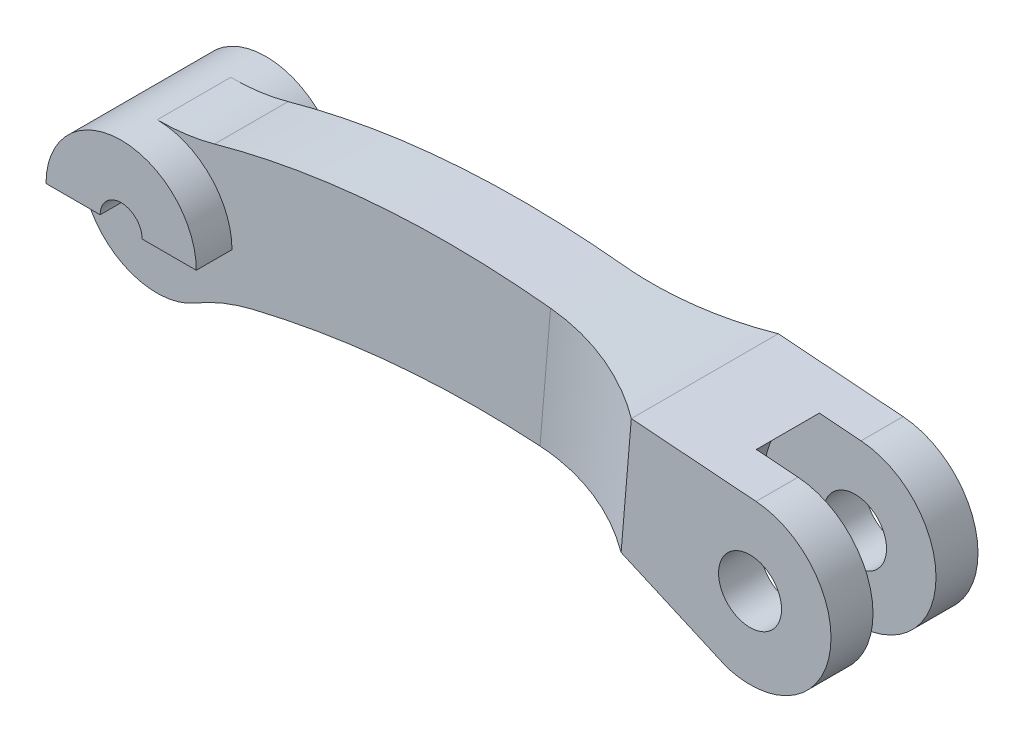
ISO-10303-21;
HEADER;
FILE_DESCRIPTION(('STEP AP214'),'2;1');
FILE_NAME('part.step','',(''),(''),'','','');
FILE_SCHEMA(('AUTOMOTIVE_DESIGN { 1 0 10303 214 1 1 1 1 }'));
ENDSEC;
DATA;
#1=APPLICATION_CONTEXT('core data for automotive mechanical design processes');
#2=APPLICATION_PROTOCOL_DEFINITION('international standard','automotive_design',2000,#1);
#3=PRODUCT_CONTEXT('',#1,'mechanical');
#4=PRODUCT('Part','Part','',(#3));
#5=PRODUCT_RELATED_PRODUCT_CATEGORY('part','',(#4));
#6=PRODUCT_DEFINITION_FORMATION('','',#4);
#7=PRODUCT_DEFINITION_CONTEXT('part definition',#1,'design');
#8=PRODUCT_DEFINITION('design','',#6,#7);
#9=PRODUCT_DEFINITION_SHAPE('','',#8);
#10=(LENGTH_UNIT() NAMED_UNIT(*) SI_UNIT(.MILLI.,.METRE.));
#11=(NAMED_UNIT(*) PLANE_ANGLE_UNIT() SI_UNIT($,.RADIAN.));
#12=(NAMED_UNIT(*) SI_UNIT($,.STERADIAN.) SOLID_ANGLE_UNIT());
#13=UNCERTAINTY_MEASURE_WITH_UNIT(LENGTH_MEASURE(1.E-05),#10,'distance_accuracy_value','');
#14=(GEOMETRIC_REPRESENTATION_CONTEXT(3) GLOBAL_UNCERTAINTY_ASSIGNED_CONTEXT((#13)) GLOBAL_UNIT_ASSIGNED_CONTEXT((#10,
#11,#12)) REPRESENTATION_CONTEXT('',''));
#15=CARTESIAN_POINT('',(0.,0.,0.));
#16=DIRECTION('',(0.,0.,1.));
#17=DIRECTION('',(1.,0.,0.));
#18=AXIS2_PLACEMENT_3D('',#15,#16,#17);
#19=CARTESIAN_POINT('',(15.4789562174928,-0.67222831700729,1.75));
#20=DIRECTION('',(0.,0.,1.));
#21=DIRECTION('',(1.,0.,0.));
#22=AXIS2_PLACEMENT_3D('',#19,#20,#21);
#23=PLANE('',#22);
#24=CARTESIAN_POINT('',(0.,0.,1.75));
#25=DIRECTION('',(0.,0.,1.));
#26=DIRECTION('',(1.,0.,0.));
#27=AXIS2_PLACEMENT_3D('',#24,#25,#26);
#28=CIRCLE('',#27,3.57888118592707);
#29=CARTESIAN_POINT('',(3.57888118592706,0.,1.75));
#30=VERTEX_POINT('',#29);
#31=CARTESIAN_POINT('',(0.0200252761575566,3.57882516076123,1.75));
#32=VERTEX_POINT('',#31);
#33=EDGE_CURVE('E244',#30,#32,#28,.T.);
#34=ORIENTED_EDGE('',*,*,#33,.F.);
#35=DIRECTION('',(1.,0.,0.));
#36=VECTOR('',#35,1.);
#37=CARTESIAN_POINT('',(0.999999999999999,0.,1.75));
#38=LINE('',#37,#36);
#39=CARTESIAN_POINT('',(0.999999999999999,0.,1.75));
#40=VERTEX_POINT('',#39);
#41=EDGE_CURVE('E213',#40,#30,#38,.T.);
#42=ORIENTED_EDGE('',*,*,#41,.F.);
#43=CARTESIAN_POINT('',(0.,0.,1.75));
#44=DIRECTION('',(0.,0.,1.));
#45=DIRECTION('',(1.,0.,0.));
#46=AXIS2_PLACEMENT_3D('',#43,#44,#45);
#47=CIRCLE('',#46,0.999999999999999);
#48=CARTESIAN_POINT('',(-0.999999999999999,0.,1.75));
#49=VERTEX_POINT('',#48);
#50=EDGE_CURVE('E321',#49,#40,#47,.T.);
#51=ORIENTED_EDGE('',*,*,#50,.F.);
#52=DIRECTION('',(1.,0.,0.));
#53=VECTOR('',#52,1.);
#54=CARTESIAN_POINT('',(-0.999999999999999,0.,1.75));
#55=LINE('',#54,#53);
#56=CARTESIAN_POINT('',(-3.57888118592708,0.,1.75));
#57=VERTEX_POINT('',#56);
#58=EDGE_CURVE('E236',#57,#49,#55,.T.);
#59=ORIENTED_EDGE('',*,*,#58,.F.);
#60=CARTESIAN_POINT('',(0.,0.,1.75));
#61=DIRECTION('',(0.,0.,1.));
#62=DIRECTION('',(1.,0.,0.));
#63=AXIS2_PLACEMENT_3D('',#60,#61,#62);
#64=CIRCLE('',#63,3.57888118592708);
#65=CARTESIAN_POINT('',(1.82196730602309,-3.08039375385125,1.75));
#66=VERTEX_POINT('',#65);
#67=EDGE_CURVE('E421',#57,#66,#64,.T.);
#68=ORIENTED_EDGE('',*,*,#67,.T.);
#69=CARTESIAN_POINT('',(6.91285244964688,-11.6875354660825,1.75));
#70=DIRECTION('',(0.,0.,1.));
#71=DIRECTION('',(1.,0.,0.));
#72=AXIS2_PLACEMENT_3D('',#69,#70,#71);
#73=CIRCLE('',#72,10.);
#74=CARTESIAN_POINT('',(4.57497043637673,-1.96465998132859,1.75));
#75=VERTEX_POINT('',#74);
#76=EDGE_CURVE('E13',#66,#75,#73,.F.);
#77=ORIENTED_EDGE('',*,*,#76,.T.);
#78=CARTESIAN_POINT('',(2.56834457009332,-2.49238775319069,1.75));
#79=CARTESIAN_POINT('',(15.4492029121807,1.18573782839704,1.75));
#80=CARTESIAN_POINT('',(28.4490744755167,-2.56800117163254,1.75));
#81=B_SPLINE_CURVE_WITH_KNOTS('',2,(#78,#79,#80),.UNSPECIFIED.,.F.,.F.,(3,3),(0.,1.),.UNSPECIFIED.);
#82=CARTESIAN_POINT('',(18.2484008446483,-0.765332039042507,1.75));
#83=VERTEX_POINT('',#82);
#84=EDGE_CURVE('E326',#75,#83,#81,.T.);
#85=ORIENTED_EDGE('',*,*,#84,.T.);
#86=DIRECTION('',(0.0839934272279586,0.996466308603809,0.));
#87=VECTOR('',#86,1.);
#88=CARTESIAN_POINT('',(18.7146392151198,4.76594395821291,1.75));
#89=LINE('',#88,#87);
#90=CARTESIAN_POINT('',(18.7489520635338,5.17301863681444,1.75));
#91=VERTEX_POINT('',#90);
#92=EDGE_CURVE('E456',#83,#91,#89,.T.);
#93=ORIENTED_EDGE('',*,*,#92,.T.);
#94=CARTESIAN_POINT('',(29.5303772913072,2.96301442984674,1.75));
#95=CARTESIAN_POINT('',(13.9500427176749,7.64913489793884,1.75));
#96=CARTESIAN_POINT('',(1.03776536775901,3.42511803949336,1.75));
#97=B_SPLINE_CURVE_WITH_KNOTS('',2,(#94,#95,#96),.UNSPECIFIED.,.F.,.F.,(3,3),(0.,1.),.UNSPECIFIED.);
#98=CARTESIAN_POINT('',(2.75285584533228,3.94361117557761,1.75));
#99=VERTEX_POINT('',#98);
#100=EDGE_CURVE('E331',#91,#99,#97,.T.);
#101=ORIENTED_EDGE('',*,*,#100,.T.);
#102=CARTESIAN_POINT('',(0.0759792883676022,13.5786686169618,1.75));
#103=DIRECTION('',(0.,0.,1.));
#104=DIRECTION('',(1.,0.,0.));
#105=AXIS2_PLACEMENT_3D('',#102,#103,#104);
#106=CIRCLE('',#105,10.);
#107=EDGE_CURVE('E502',#99,#32,#106,.F.);
#108=ORIENTED_EDGE('',*,*,#107,.T.);
#109=EDGE_LOOP('',(#34,#42,#51,#59,#68,#77,#85,#93,#101,#108));
#110=FACE_BOUND('',#109,.T.);
#111=ADVANCED_FACE('F46',(#110),#23,.T.);
#112=CARTESIAN_POINT('',(30.,0.,3.5));
#113=DIRECTION('',(0.,0.,-1.));
#114=DIRECTION('',(-1.,0.,0.));
#115=AXIS2_PLACEMENT_3D('',#112,#113,#114);
#116=CYLINDRICAL_SURFACE('',#115,3.85694958374146);
#117=CARTESIAN_POINT('',(30.,0.,-1.5));
#118=DIRECTION('',(0.,0.,1.));
#119=DIRECTION('',(1.,0.,0.));
#120=AXIS2_PLACEMENT_3D('',#117,#118,#119);
#121=CIRCLE('',#120,3.85694958374146);
#122=CARTESIAN_POINT('',(28.92532622388,-3.7042052273657,-1.5));
#123=VERTEX_POINT('',#122);
#124=CARTESIAN_POINT('',(30.2880988867762,3.8461746090059,-1.5));
#125=VERTEX_POINT('',#124);
#126=EDGE_CURVE('E275',#123,#125,#121,.T.);
#127=ORIENTED_EDGE('',*,*,#126,.F.);
#128=DIRECTION('',(0.,0.,-1.));
#129=VECTOR('',#128,1.);
#130=CARTESIAN_POINT('',(28.92532622388,-3.7042052273657,3.5));
#131=LINE('',#130,#129);
#132=CARTESIAN_POINT('',(28.92532622388,-3.7042052273657,-3.5));
#133=VERTEX_POINT('',#132);
#134=EDGE_CURVE('E301',#123,#133,#131,.T.);
#135=ORIENTED_EDGE('',*,*,#134,.T.);
#136=CARTESIAN_POINT('',(30.,0.,-3.5));
#137=DIRECTION('',(0.,0.,1.));
#138=DIRECTION('',(1.,0.,0.));
#139=AXIS2_PLACEMENT_3D('',#136,#137,#138);
#140=CIRCLE('',#139,3.85694958374146);
#141=CARTESIAN_POINT('',(30.2880988867762,3.8461746090059,-3.5));
#142=VERTEX_POINT('',#141);
#143=EDGE_CURVE('E286',#133,#142,#140,.T.);
#144=ORIENTED_EDGE('',*,*,#143,.T.);
#145=DIRECTION('',(0.,0.,-1.));
#146=VECTOR('',#145,1.);
#147=CARTESIAN_POINT('',(30.2880988867762,3.8461746090059,3.5));
#148=LINE('',#147,#146);
#149=EDGE_CURVE('E317',#125,#142,#148,.T.);
#150=ORIENTED_EDGE('',*,*,#149,.F.);
#151=EDGE_LOOP('',(#127,#135,#144,#150));
#152=FACE_BOUND('',#151,.T.);
#153=ADVANCED_FACE('F392',(#152),#116,.T.);
#154=CARTESIAN_POINT('',(30.2880988867762,3.8461746090059,3.5));
#155=DIRECTION('',(-0.0746960468427019,-0.99720634804742,0.));
#156=DIRECTION('',(0.99720634804742,-0.0746960468427019,0.));
#157=AXIS2_PLACEMENT_3D('',#154,#155,#156);
#158=PLANE('',#157);
#159=DIRECTION('',(-0.99720634804742,0.0746960468427019,0.));
#160=VECTOR('',#159,1.);
#161=CARTESIAN_POINT('',(30.2880988867762,3.8461746090059,-1.5));
#162=LINE('',#161,#160);
#163=CARTESIAN_POINT('',(28.2994147796355,3.99513760098162,-1.5));
#164=VERTEX_POINT('',#163);
#165=EDGE_CURVE('E277',#125,#164,#162,.T.);
#166=ORIENTED_EDGE('',*,*,#165,.F.);
#167=ORIENTED_EDGE('',*,*,#149,.T.);
#168=DIRECTION('',(-0.99720634804742,0.0746960468427019,0.));
#169=VECTOR('',#168,1.);
#170=CARTESIAN_POINT('',(30.2880988867762,3.8461746090059,-3.5));
#171=LINE('',#170,#169);
#172=CARTESIAN_POINT('',(24.3459964462684,4.29126961174948,-3.5));
#173=VERTEX_POINT('',#172);
#174=EDGE_CURVE('E304',#142,#173,#171,.T.);
#175=ORIENTED_EDGE('',*,*,#174,.T.);
#176=DIRECTION('',(0.,0.,-1.));
#177=VECTOR('',#176,1.);
#178=CARTESIAN_POINT('',(24.3459964462684,4.29126961174948,1.75));
#179=LINE('',#178,#177);
#180=CARTESIAN_POINT('',(24.3459964462701,4.29126961176963,3.5));
#181=VERTEX_POINT('',#180);
#182=EDGE_CURVE('E427',#173,#181,#179,.F.);
#183=ORIENTED_EDGE('',*,*,#182,.T.);
#184=DIRECTION('',(-0.99720634804742,0.0746960468427019,0.));
#185=VECTOR('',#184,1.);
#186=CARTESIAN_POINT('',(30.2880988867762,3.8461746090059,3.5));
#187=LINE('',#186,#185);
#188=CARTESIAN_POINT('',(30.2880988867762,3.8461746090059,3.5));
#189=VERTEX_POINT('',#188);
#190=EDGE_CURVE('E292',#189,#181,#187,.T.);
#191=ORIENTED_EDGE('',*,*,#190,.F.);
#192=CARTESIAN_POINT('',(30.2880988867762,3.8461746090059,1.5));
#193=VERTEX_POINT('',#192);
#194=EDGE_CURVE('E318',#189,#193,#148,.T.);
#195=ORIENTED_EDGE('',*,*,#194,.T.);
#196=DIRECTION('',(-0.99720634804742,0.0746960468427019,0.));
#197=VECTOR('',#196,1.);
#198=CARTESIAN_POINT('',(30.2880988867762,3.8461746090059,1.5));
#199=LINE('',#198,#197);
#200=CARTESIAN_POINT('',(28.2994147796355,3.99513760098162,1.5));
#201=VERTEX_POINT('',#200);
#202=EDGE_CURVE('E269',#193,#201,#199,.T.);
#203=ORIENTED_EDGE('',*,*,#202,.T.);
#204=DIRECTION('',(0.,0.,1.));
#205=VECTOR('',#204,1.);
#206=CARTESIAN_POINT('',(28.2994147796355,3.99513760098162,-1.5));
#207=LINE('',#206,#205);
#208=EDGE_CURVE('E279',#201,#164,#207,.F.);
#209=ORIENTED_EDGE('',*,*,#208,.T.);
#210=EDGE_LOOP('',(#166,#167,#175,#183,#191,#195,#203,#209));
#211=FACE_BOUND('',#210,.T.);
#212=ADVANCED_FACE('F398',(#211),#158,.F.);
#213=CARTESIAN_POINT('',(23.860056265525,-1.47374122408052,3.5));
#214=DIRECTION('',(0.403002780325365,0.915198753850783,0.));
#215=DIRECTION('',(-0.915198753850783,0.403002780325365,0.));
#216=AXIS2_PLACEMENT_3D('',#213,#214,#215);
#217=PLANE('',#216);
#218=DIRECTION('',(0.915198753850783,-0.403002780325365,0.));
#219=VECTOR('',#218,1.);
#220=CARTESIAN_POINT('',(23.860056265525,-1.47374122408052,-1.5));
#221=LINE('',#220,#219);
#222=CARTESIAN_POINT('',(26.5755370853072,-2.6694883945043,-1.5));
#223=VERTEX_POINT('',#222);
#224=EDGE_CURVE('E273',#223,#123,#221,.T.);
#225=ORIENTED_EDGE('',*,*,#224,.F.);
#226=DIRECTION('',(0.,0.,1.));
#227=VECTOR('',#226,1.);
#228=CARTESIAN_POINT('',(26.5755370853072,-2.6694883945043,-1.5));
#229=LINE('',#228,#227);
#230=CARTESIAN_POINT('',(26.5755370853072,-2.6694883945043,1.5));
#231=VERTEX_POINT('',#230);
#232=EDGE_CURVE('E428',#223,#231,#229,.T.);
#233=ORIENTED_EDGE('',*,*,#232,.T.);
#234=DIRECTION('',(0.915198753850783,-0.403002780325365,0.));
#235=VECTOR('',#234,1.);
#236=CARTESIAN_POINT('',(23.860056265525,-1.47374122408052,1.5));
#237=LINE('',#236,#235);
#238=CARTESIAN_POINT('',(28.92532622388,-3.7042052273657,1.5));
#239=VERTEX_POINT('',#238);
#240=EDGE_CURVE('E263',#231,#239,#237,.T.);
#241=ORIENTED_EDGE('',*,*,#240,.T.);
#242=CARTESIAN_POINT('',(28.92532622388,-3.7042052273657,3.5));
#243=VERTEX_POINT('',#242);
#244=EDGE_CURVE('E312',#243,#239,#131,.T.);
#245=ORIENTED_EDGE('',*,*,#244,.F.);
#246=DIRECTION('',(0.915198753850783,-0.403002780325365,0.));
#247=VECTOR('',#246,1.);
#248=CARTESIAN_POINT('',(23.860056265525,-1.47374122408052,3.5));
#249=LINE('',#248,#247);
#250=CARTESIAN_POINT('',(23.860056265525,-1.47374122408052,3.5));
#251=VERTEX_POINT('',#250);
#252=EDGE_CURVE('E299',#251,#243,#249,.T.);
#253=ORIENTED_EDGE('',*,*,#252,.F.);
#254=DIRECTION('',(0.,0.,-1.));
#255=VECTOR('',#254,1.);
#256=CARTESIAN_POINT('',(23.860056265525,-1.47374122408052,3.5));
#257=LINE('',#256,#255);
#258=CARTESIAN_POINT('',(23.860056265525,-1.47374122408052,-3.5));
#259=VERTEX_POINT('',#258);
#260=EDGE_CURVE('E315',#251,#259,#257,.T.);
#261=ORIENTED_EDGE('',*,*,#260,.T.);
#262=DIRECTION('',(0.915198753850783,-0.403002780325365,0.));
#263=VECTOR('',#262,1.);
#264=CARTESIAN_POINT('',(23.860056265525,-1.47374122408052,-3.5));
#265=LINE('',#264,#263);
#266=EDGE_CURVE('E293',#259,#133,#265,.T.);
#267=ORIENTED_EDGE('',*,*,#266,.T.);
#268=ORIENTED_EDGE('',*,*,#134,.F.);
#269=EDGE_LOOP('',(#225,#233,#241,#245,#253,#261,#267,#268));
#270=FACE_BOUND('',#269,.T.);
#271=ADVANCED_FACE('F478',(#270),#217,.F.);
#272=CARTESIAN_POINT('',(30.,0.,1.75));
#273=DIRECTION('',(0.,0.,-1.));
#274=DIRECTION('',(-1.,0.,0.));
#275=AXIS2_PLACEMENT_3D('',#272,#273,#274);
#276=CYLINDRICAL_SURFACE('',#275,1.5);
#277=CARTESIAN_POINT('',(30.,0.,-3.5));
#278=DIRECTION('',(0.,0.,1.));
#279=DIRECTION('',(1.,0.,0.));
#280=AXIS2_PLACEMENT_3D('',#277,#278,#279);
#281=CIRCLE('',#280,1.5);
#282=CARTESIAN_POINT('',(31.5,0.,-3.5));
#283=VERTEX_POINT('',#282);
#284=EDGE_CURVE('E282',#283,#283,#281,.T.);
#285=ORIENTED_EDGE('',*,*,#284,.F.);
#286=EDGE_LOOP('',(#285));
#287=FACE_BOUND('',#286,.T.);
#288=CARTESIAN_POINT('',(30.,0.,-1.5));
#289=DIRECTION('',(0.,0.,1.));
#290=DIRECTION('',(1.,0.,0.));
#291=AXIS2_PLACEMENT_3D('',#288,#289,#290);
#292=CIRCLE('',#291,1.5);
#293=CARTESIAN_POINT('',(31.5,0.,-1.5));
#294=VERTEX_POINT('',#293);
#295=EDGE_CURVE('E272',#294,#294,#292,.T.);
#296=ORIENTED_EDGE('',*,*,#295,.T.);
#297=EDGE_LOOP('',(#296));
#298=FACE_BOUND('',#297,.T.);
#299=ADVANCED_FACE('F407',(#287,#298),#276,.F.);
#300=CARTESIAN_POINT('',(15.4789562174928,-0.67222831700729,-1.75));
#301=DIRECTION('',(0.,0.,1.));
#302=DIRECTION('',(1.,0.,0.));
#303=AXIS2_PLACEMENT_3D('',#300,#301,#302);
#304=PLANE('',#303);
#305=CARTESIAN_POINT('',(0.,0.,-1.75));
#306=DIRECTION('',(0.,0.,1.));
#307=DIRECTION('',(1.,0.,0.));
#308=AXIS2_PLACEMENT_3D('',#305,#306,#307);
#309=CIRCLE('',#308,3.57888118592708);
#310=CARTESIAN_POINT('',(-3.57888118592708,0.,-1.75));
#311=VERTEX_POINT('',#310);
#312=CARTESIAN_POINT('',(1.82196730602309,-3.08039375385125,-1.75));
#313=VERTEX_POINT('',#312);
#314=EDGE_CURVE('E68',#311,#313,#309,.T.);
#315=ORIENTED_EDGE('',*,*,#314,.F.);
#316=DIRECTION('',(1.,0.,0.));
#317=VECTOR('',#316,1.);
#318=CARTESIAN_POINT('',(15.4789562174928,1.59702980007115E-13,-1.75));
#319=LINE('',#318,#317);
#320=CARTESIAN_POINT('',(-1.00000000000001,0.,-1.75));
#321=VERTEX_POINT('',#320);
#322=EDGE_CURVE('E223',#311,#321,#319,.T.);
#323=ORIENTED_EDGE('',*,*,#322,.T.);
#324=CARTESIAN_POINT('',(0.,0.,-1.75));
#325=DIRECTION('',(0.,0.,1.));
#326=DIRECTION('',(1.,0.,0.));
#327=AXIS2_PLACEMENT_3D('',#324,#325,#326);
#328=CIRCLE('',#327,0.999999999999999);
#329=CARTESIAN_POINT('',(0.999999999999999,0.,-1.75));
#330=VERTEX_POINT('',#329);
#331=EDGE_CURVE('E210',#321,#330,#328,.T.);
#332=ORIENTED_EDGE('',*,*,#331,.T.);
#333=DIRECTION('',(1.,0.,0.));
#334=VECTOR('',#333,1.);
#335=CARTESIAN_POINT('',(15.4789562174928,0.,-1.75));
#336=LINE('',#335,#334);
#337=CARTESIAN_POINT('',(3.57888118592706,0.,-1.75));
#338=VERTEX_POINT('',#337);
#339=EDGE_CURVE('E61',#330,#338,#336,.T.);
#340=ORIENTED_EDGE('',*,*,#339,.T.);
#341=CARTESIAN_POINT('',(0.,0.,-1.75));
#342=DIRECTION('',(0.,0.,1.));
#343=DIRECTION('',(1.,0.,0.));
#344=AXIS2_PLACEMENT_3D('',#341,#342,#343);
#345=CIRCLE('',#344,3.57888118592707);
#346=CARTESIAN_POINT('',(0.020025276157564,3.57882516076123,-1.75));
#347=VERTEX_POINT('',#346);
#348=EDGE_CURVE('E225',#338,#347,#345,.T.);
#349=ORIENTED_EDGE('',*,*,#348,.T.);
#350=CARTESIAN_POINT('',(0.0759792883676022,13.5786686169618,-1.75));
#351=DIRECTION('',(0.,0.,1.));
#352=DIRECTION('',(1.,0.,0.));
#353=AXIS2_PLACEMENT_3D('',#350,#351,#352);
#354=CIRCLE('',#353,10.);
#355=CARTESIAN_POINT('',(2.75285584533228,3.94361117557761,-1.75));
#356=VERTEX_POINT('',#355);
#357=EDGE_CURVE('E496',#347,#356,#354,.T.);
#358=ORIENTED_EDGE('',*,*,#357,.T.);
#359=CARTESIAN_POINT('',(29.5303772913072,2.96301442984674,-1.75));
#360=CARTESIAN_POINT('',(13.9500427176749,7.64913489793884,-1.75));
#361=CARTESIAN_POINT('',(1.03776536775901,3.42511803949336,-1.75));
#362=B_SPLINE_CURVE_WITH_KNOTS('',2,(#359,#360,#361),.UNSPECIFIED.,.F.,.F.,(3,3),(0.,1.),.UNSPECIFIED.);
#363=CARTESIAN_POINT('',(18.7489520635338,5.17301863681444,-1.75));
#364=VERTEX_POINT('',#363);
#365=EDGE_CURVE('E435',#364,#356,#362,.T.);
#366=ORIENTED_EDGE('',*,*,#365,.F.);
#367=DIRECTION('',(-0.0839934272279586,-0.996466308603809,0.));
#368=VECTOR('',#367,1.);
#369=CARTESIAN_POINT('',(18.2366551682102,-0.904678309680141,-1.75));
#370=LINE('',#369,#368);
#371=CARTESIAN_POINT('',(18.2484008446483,-0.765332039042507,-1.75));
#372=VERTEX_POINT('',#371);
#373=EDGE_CURVE('E453',#364,#372,#370,.T.);
#374=ORIENTED_EDGE('',*,*,#373,.T.);
#375=CARTESIAN_POINT('',(2.56834457009332,-2.49238775319069,-1.75));
#376=CARTESIAN_POINT('',(15.4492029121807,1.18573782839704,-1.75));
#377=CARTESIAN_POINT('',(28.4490744755167,-2.56800117163254,-1.75));
#378=B_SPLINE_CURVE_WITH_KNOTS('',2,(#375,#376,#377),.UNSPECIFIED.,.F.,.F.,(3,3),(0.,1.),.UNSPECIFIED.);
#379=CARTESIAN_POINT('',(4.57497043637672,-1.96465998132859,-1.75));
#380=VERTEX_POINT('',#379);
#381=EDGE_CURVE('E324',#380,#372,#378,.T.);
#382=ORIENTED_EDGE('',*,*,#381,.F.);
#383=CARTESIAN_POINT('',(6.91285244964688,-11.6875354660825,-1.75));
#384=DIRECTION('',(0.,0.,1.));
#385=DIRECTION('',(1.,0.,0.));
#386=AXIS2_PLACEMENT_3D('',#383,#384,#385);
#387=CIRCLE('',#386,10.);
#388=EDGE_CURVE('E54',#380,#313,#387,.T.);
#389=ORIENTED_EDGE('',*,*,#388,.T.);
#390=EDGE_LOOP('',(#315,#323,#332,#340,#349,#358,#366,#374,#382,#389));
#391=FACE_BOUND('',#390,.T.);
#392=ADVANCED_FACE('F346',(#391),#304,.F.);
#393=DIRECTION('',(0.,0.,-1.));
#394=VECTOR('',#393,1.);
#395=SURFACE_OF_LINEAR_EXTRUSION('',#81,#394);
#396=ORIENTED_EDGE('',*,*,#84,.F.);
#397=DIRECTION('',(0.,0.,-1.));
#398=VECTOR('',#397,1.);
#399=CARTESIAN_POINT('',(4.57497043637708,-1.9646599813285,1.75));
#400=LINE('',#399,#398);
#401=EDGE_CURVE('E503',#75,#380,#400,.T.);
#402=ORIENTED_EDGE('',*,*,#401,.T.);
#403=ORIENTED_EDGE('',*,*,#381,.T.);
#404=CARTESIAN_POINT('',(18.2484008446483,-0.76533203904251,-1.75));
#405=CARTESIAN_POINT('',(18.5282691285124,-0.783296112776408,-1.74996352775269));
#406=CARTESIAN_POINT('',(18.8079645500961,-0.803901787671125,-1.76179088571991));
#407=CARTESIAN_POINT('',(19.3649594725598,-0.850045605428343,-1.80894076762686));
#408=CARTESIAN_POINT('',(19.6422589715891,-0.875583752100337,-1.84426330971265));
#409=CARTESIAN_POINT('',(20.1855635273802,-0.930548961027655,-1.93700217112846));
#410=CARTESIAN_POINT('',(20.4516779011002,-0.959863383728166,-1.99384658610989));
#411=CARTESIAN_POINT('',(20.9778316830621,-1.022361447658,-2.12921462969119));
#412=CARTESIAN_POINT('',(21.2378721596619,-1.05554440219209,-2.20773441411484));
#413=CARTESIAN_POINT('',(21.701868804443,-1.11863192939122,-2.36907672061322));
#414=CARTESIAN_POINT('',(21.9071618127568,-1.14797646225319,-2.44830204982901));
#415=CARTESIAN_POINT('',(22.3117342808631,-1.20847361374403,-2.62026547727487));
#416=CARTESIAN_POINT('',(22.5110139239367,-1.23962617718128,-2.71300316315951));
#417=CARTESIAN_POINT('',(22.9067654346865,-1.3040125312927,-2.91361696809263));
#418=CARTESIAN_POINT('',(23.1030936393864,-1.33727606572953,-3.02176687150119));
#419=CARTESIAN_POINT('',(23.487773951348,-1.40484176058597,-3.25118065407654));
#420=CARTESIAN_POINT('',(23.6761252602329,-1.43914402438154,-3.37244584160566));
#421=CARTESIAN_POINT('',(23.8600562655186,-1.47374122413124,-3.49999999999855));
#422=B_SPLINE_CURVE_WITH_KNOTS('',3,(#404,#405,#406,#407,#408,#409,#410,#411,#412,#413,#414,
#415,#416,#417,#418,#419,#420,#421),.UNSPECIFIED.,.F.,.F.,(4,2,2,2,2,2,2,2,4),(0.,
0.841068827581901,1.68213830474856,2.50226977233456,3.32225588107799,3.98776793389279,
4.65325968207825,5.33253629646536,6.01188073714731),.UNSPECIFIED.);
#423=EDGE_CURVE('E355',#372,#259,#422,.T.);
#424=ORIENTED_EDGE('',*,*,#423,.T.);
#425=ORIENTED_EDGE('',*,*,#260,.F.);
#426=CARTESIAN_POINT('',(23.860056265525,-1.47374122408052,3.5));
#427=CARTESIAN_POINT('',(23.6314533389367,-1.43073418319835,3.3414474805543));
#428=CARTESIAN_POINT('',(23.3960022978897,-1.38818956161063,3.19262503956826));
#429=CARTESIAN_POINT('',(22.913018090357,-1.30485920775308,2.9153981028605));
#430=CARTESIAN_POINT('',(22.6654827194869,-1.26407379896826,2.78699735072365));
#431=CARTESIAN_POINT('',(22.1663691967778,-1.18610276475482,2.55458275984172));
#432=CARTESIAN_POINT('',(21.9150482642508,-1.14885249924155,2.45003792589635));
#433=CARTESIAN_POINT('',(21.4042316567726,-1.07753379656887,2.26208794372119));
#434=CARTESIAN_POINT('',(21.1447378725346,-1.0434646306178,2.17867794594733));
#435=CARTESIAN_POINT('',(20.6706286629399,-0.985399148902712,2.04776519082933));
#436=CARTESIAN_POINT('',(20.4571433646697,-0.960734916404846,1.99643134417925));
#437=CARTESIAN_POINT('',(20.0269512021953,-0.914125209313255,1.90808219158994));
#438=CARTESIAN_POINT('',(19.8102446723258,-0.892179454742584,1.8710654102966));
#439=CARTESIAN_POINT('',(19.3700697414867,-0.850805107568669,1.81091524567222));
#440=CARTESIAN_POINT('',(19.1465541651943,-0.831437928680498,1.78808468211419));
#441=CARTESIAN_POINT('',(18.6981965431113,-0.795925990317345,1.75761836470642));
#442=CARTESIAN_POINT('',(18.4733542748567,-0.779781788058739,1.74998523627873));
#443=CARTESIAN_POINT('',(18.2484008446483,-0.765332039042507,1.75));
#444=B_SPLINE_CURVE_WITH_KNOTS('',3,(#426,#427,#428,#429,#430,#431,#432,#433,#434,#435,#436,
#437,#438,#439,#440,#441,#442,#443),.UNSPECIFIED.,.F.,.F.,(4,2,2,2,2,2,2,2,4),(0.,
0.844299460205278,1.68875351451699,2.51202224693983,3.33510190286249,3.99747440087051,
4.65977862409652,5.33577416052052,6.0118864679418),.UNSPECIFIED.);
#445=EDGE_CURVE('E363',#251,#83,#444,.T.);
#446=ORIENTED_EDGE('',*,*,#445,.T.);
#447=EDGE_LOOP('',(#396,#402,#403,#424,#425,#446));
#448=FACE_BOUND('',#447,.T.);
#449=ADVANCED_FACE('F340',(#448),#395,.F.);
#450=DIRECTION('',(0.,0.,-1.));
#451=VECTOR('',#450,1.);
#452=SURFACE_OF_LINEAR_EXTRUSION('',#97,#451);
#453=ORIENTED_EDGE('',*,*,#365,.T.);
#454=DIRECTION('',(0.,0.,-1.));
#455=VECTOR('',#454,1.);
#456=CARTESIAN_POINT('',(2.75285584533228,3.94361117557761,-1.75));
#457=LINE('',#456,#455);
#458=EDGE_CURVE('E498',#356,#99,#457,.F.);
#459=ORIENTED_EDGE('',*,*,#458,.T.);
#460=ORIENTED_EDGE('',*,*,#100,.F.);
#461=CARTESIAN_POINT('',(18.7489520635154,5.17301863663513,1.75));
#462=CARTESIAN_POINT('',(18.9364036543828,5.15372367423393,1.74999316595883));
#463=CARTESIAN_POINT('',(19.1237437224031,5.13336739345639,1.75532447679933));
#464=CARTESIAN_POINT('',(19.4975871230781,5.09065953225252,1.77660684479373));
#465=CARTESIAN_POINT('',(19.6840904755827,5.06830799942639,1.79255764865978));
#466=CARTESIAN_POINT('',(20.0556565917793,5.0217359338948,1.83502255990889));
#467=CARTESIAN_POINT('',(20.2407193489809,4.99751539277423,1.86153671485514));
#468=CARTESIAN_POINT('',(20.6042591115819,4.94798232624849,1.92423986068627));
#469=CARTESIAN_POINT('',(20.782785885221,4.92271154499203,1.96017372905356));
#470=CARTESIAN_POINT('',(21.1373484439451,4.87070704119114,2.04186188563864));
#471=CARTESIAN_POINT('',(21.3133844245344,4.84397343427574,2.08761539849583));
#472=CARTESIAN_POINT('',(21.6624210482167,4.78922764134638,2.18877759816767));
#473=CARTESIAN_POINT('',(21.8354221740747,4.76121566128834,2.24418473373278));
#474=CARTESIAN_POINT('',(22.2121001150067,4.69840232074607,2.37648548378538));
#475=CARTESIAN_POINT('',(22.4150096516655,4.66336154462507,2.45546040713015));
#476=CARTESIAN_POINT('',(22.814937050276,4.59207274088526,2.62668571784368));
#477=CARTESIAN_POINT('',(23.011954522295,4.5558246337002,2.71893698149365));
#478=CARTESIAN_POINT('',(23.4031940024473,4.48176154034549,2.91829246977831));
#479=CARTESIAN_POINT('',(23.5972792106326,4.44392969446534,3.02565902052825));
#480=CARTESIAN_POINT('',(23.9776776512058,4.36782417983428,3.25328618649719));
#481=CARTESIAN_POINT('',(24.1639899509184,4.32955045876198,3.37354834292092));
#482=CARTESIAN_POINT('',(24.3459964462684,4.29126961174948,3.5));
#483=B_SPLINE_CURVE_WITH_KNOTS('',3,(#461,#462,#463,#464,#465,#466,#467,#468,#469,#470,#471,
#472,#473,#474,#475,#476,#477,#478,#479,#480,#481,#482),.UNSPECIFIED.,.F.,.F.,(4,2,2,2,2,2,2,2,
2,2,4),(0.,0.565244169226769,1.13047485717362,1.69570809019184,2.24698119188058,
2.79821078096645,3.34935187401715,4.0104684653414,4.67162871251988,5.34614074277075,
6.02073347665455),.UNSPECIFIED.);
#484=EDGE_CURVE('E371',#91,#181,#483,.T.);
#485=ORIENTED_EDGE('',*,*,#484,.T.);
#486=ORIENTED_EDGE('',*,*,#182,.F.);
#487=CARTESIAN_POINT('',(24.3459964462684,4.29126961174948,-3.5));
#488=CARTESIAN_POINT('',(24.1163377061301,4.33957803367591,-3.34042310976738));
#489=CARTESIAN_POINT('',(23.8798073309903,4.38787099735247,-3.19071752490945));
#490=CARTESIAN_POINT('',(23.3946270643573,4.48359315225755,-2.91200536603785));
#491=CARTESIAN_POINT('',(23.1459750215909,4.53102218809514,-2.78300248376678));
#492=CARTESIAN_POINT('',(22.6445811181886,4.62300584122135,-2.54965239339235));
#493=CARTESIAN_POINT('',(22.3920953819401,4.66760262882185,-2.44477110799556));
#494=CARTESIAN_POINT('',(21.878912384115,4.7544327247093,-2.25642362763287));
#495=CARTESIAN_POINT('',(21.6182170434798,4.79666657956378,-2.17295246416793));
#496=CARTESIAN_POINT('',(21.1451094202199,4.86965909780872,-2.04306878680814));
#497=CARTESIAN_POINT('',(20.9338975915299,4.90098097491672,-1.99256077614309));
#498=CARTESIAN_POINT('',(20.5082887397534,4.96143143032373,-1.90561706621535));
#499=CARTESIAN_POINT('',(20.2938918773758,4.99056011883856,-1.86918065942211));
#500=CARTESIAN_POINT('',(19.8584911913326,5.04692321227415,-1.80997940076598));
#501=CARTESIAN_POINT('',(19.6374413371544,5.07410754549331,-1.78750519468304));
#502=CARTESIAN_POINT('',(19.1939647519601,5.12570164813544,-1.75750730878286));
#503=CARTESIAN_POINT('',(18.9715377641095,5.15011088249729,-1.74998650750747));
#504=CARTESIAN_POINT('',(18.7489520635429,5.17301863681351,-1.75));
#505=B_SPLINE_CURVE_WITH_KNOTS('',3,(#487,#488,#489,#490,#491,#492,#493,#494,#495,#496,#497,
#498,#499,#500,#501,#502,#503,#504),.UNSPECIFIED.,.F.,.F.,(4,2,2,2,2,2,2,2,4),(0.,
0.851158615298395,1.70246884246092,2.53257518361678,3.36248871308764,4.02026968197958,
4.67801757285586,5.34903515497346,6.02018189598705),.UNSPECIFIED.);
#506=EDGE_CURVE('E458',#173,#364,#505,.T.);
#507=ORIENTED_EDGE('',*,*,#506,.T.);
#508=EDGE_LOOP('',(#453,#459,#460,#485,#486,#507));
#509=FACE_BOUND('',#508,.T.);
#510=ADVANCED_FACE('F345',(#509),#452,.F.);
#511=CARTESIAN_POINT('',(0.,0.,1.75));
#512=DIRECTION('',(0.,0.,-1.));
#513=DIRECTION('',(-1.,0.,0.));
#514=AXIS2_PLACEMENT_3D('',#511,#512,#513);
#515=CYLINDRICAL_SURFACE('',#514,3.57888118592708);
#516=ORIENTED_EDGE('',*,*,#67,.F.);
#517=DIRECTION('',(0.,0.,-1.));
#518=VECTOR('',#517,1.);
#519=CARTESIAN_POINT('',(-3.57888118592708,0.,3.45));
#520=LINE('',#519,#518);
#521=CARTESIAN_POINT('',(-3.57888118592708,0.,3.45));
#522=VERTEX_POINT('',#521);
#523=EDGE_CURVE('E249',#522,#57,#520,.T.);
#524=ORIENTED_EDGE('',*,*,#523,.F.);
#525=CARTESIAN_POINT('',(0.,0.,3.45));
#526=DIRECTION('',(0.,0.,1.));
#527=DIRECTION('',(1.,0.,0.));
#528=AXIS2_PLACEMENT_3D('',#525,#526,#527);
#529=CIRCLE('',#528,3.57888118592707);
#530=CARTESIAN_POINT('',(3.57888118592706,0.,3.45));
#531=VERTEX_POINT('',#530);
#532=EDGE_CURVE('E238',#531,#522,#529,.T.);
#533=ORIENTED_EDGE('',*,*,#532,.F.);
#534=DIRECTION('',(0.,0.,-1.));
#535=VECTOR('',#534,1.);
#536=CARTESIAN_POINT('',(3.57888118592706,0.,3.45));
#537=LINE('',#536,#535);
#538=EDGE_CURVE('E251',#531,#30,#537,.T.);
#539=ORIENTED_EDGE('',*,*,#538,.T.);
#540=ORIENTED_EDGE('',*,*,#33,.T.);
#541=DIRECTION('',(0.,0.,-1.));
#542=VECTOR('',#541,1.);
#543=CARTESIAN_POINT('',(0.020025276157564,3.57882516076123,1.75));
#544=LINE('',#543,#542);
#545=EDGE_CURVE('E504',#32,#347,#544,.T.);
#546=ORIENTED_EDGE('',*,*,#545,.T.);
#547=ORIENTED_EDGE('',*,*,#348,.F.);
#548=DIRECTION('',(0.,0.,1.));
#549=VECTOR('',#548,1.);
#550=CARTESIAN_POINT('',(3.57888118592706,0.,-3.45));
#551=LINE('',#550,#549);
#552=CARTESIAN_POINT('',(3.57888118592706,0.,-3.45));
#553=VERTEX_POINT('',#552);
#554=EDGE_CURVE('E229',#553,#338,#551,.T.);
#555=ORIENTED_EDGE('',*,*,#554,.F.);
#556=CARTESIAN_POINT('',(0.,0.,-3.45));
#557=DIRECTION('',(0.,0.,1.));
#558=DIRECTION('',(1.,0.,0.));
#559=AXIS2_PLACEMENT_3D('',#556,#557,#558);
#560=CIRCLE('',#559,3.57888118592707);
#561=CARTESIAN_POINT('',(-3.57888118592708,0.,-3.45));
#562=VERTEX_POINT('',#561);
#563=EDGE_CURVE('E217',#553,#562,#560,.T.);
#564=ORIENTED_EDGE('',*,*,#563,.T.);
#565=DIRECTION('',(0.,0.,1.));
#566=VECTOR('',#565,1.);
#567=CARTESIAN_POINT('',(-3.57888118592708,0.,-3.45));
#568=LINE('',#567,#566);
#569=EDGE_CURVE('E214',#562,#311,#568,.T.);
#570=ORIENTED_EDGE('',*,*,#569,.T.);
#571=ORIENTED_EDGE('',*,*,#314,.T.);
#572=DIRECTION('',(0.,0.,-1.));
#573=VECTOR('',#572,1.);
#574=CARTESIAN_POINT('',(1.82196730602309,-3.08039375385125,1.75));
#575=LINE('',#574,#573);
#576=EDGE_CURVE('E370',#313,#66,#575,.F.);
#577=ORIENTED_EDGE('',*,*,#576,.T.);
#578=EDGE_LOOP('',(#516,#524,#533,#539,#540,#546,#547,#555,#564,#570,#571,#577));
#579=FACE_BOUND('',#578,.T.);
#580=ADVANCED_FACE('F408',(#579),#515,.T.);
#581=CARTESIAN_POINT('',(0.,0.,1.75));
#582=DIRECTION('',(0.,0.,-1.));
#583=DIRECTION('',(-1.,0.,0.));
#584=AXIS2_PLACEMENT_3D('',#581,#582,#583);
#585=CYLINDRICAL_SURFACE('',#584,0.999999999999999);
#586=ORIENTED_EDGE('',*,*,#50,.T.);
#587=DIRECTION('',(0.,0.,-1.));
#588=VECTOR('',#587,1.);
#589=CARTESIAN_POINT('',(0.999999999999999,0.,3.45));
#590=LINE('',#589,#588);
#591=CARTESIAN_POINT('',(0.999999999999999,0.,3.45));
#592=VERTEX_POINT('',#591);
#593=EDGE_CURVE('E254',#592,#40,#590,.T.);
#594=ORIENTED_EDGE('',*,*,#593,.F.);
#595=CARTESIAN_POINT('',(0.,0.,3.45));
#596=DIRECTION('',(0.,0.,-1.));
#597=DIRECTION('',(1.,0.,0.));
#598=AXIS2_PLACEMENT_3D('',#595,#596,#597);
#599=CIRCLE('',#598,0.999999999999999);
#600=CARTESIAN_POINT('',(-0.999999999999999,0.,3.45));
#601=VERTEX_POINT('',#600);
#602=EDGE_CURVE('E232',#601,#592,#599,.T.);
#603=ORIENTED_EDGE('',*,*,#602,.F.);
#604=DIRECTION('',(0.,0.,-1.));
#605=VECTOR('',#604,1.);
#606=CARTESIAN_POINT('',(-0.999999999999999,0.,3.45));
#607=LINE('',#606,#605);
#608=EDGE_CURVE('E242',#601,#49,#607,.T.);
#609=ORIENTED_EDGE('',*,*,#608,.T.);
#610=EDGE_LOOP('',(#586,#594,#603,#609));
#611=FACE_BOUND('',#610,.T.);
#612=ORIENTED_EDGE('',*,*,#331,.F.);
#613=DIRECTION('',(0.,0.,1.));
#614=VECTOR('',#613,1.);
#615=CARTESIAN_POINT('',(-1.00000000000001,0.,-3.45));
#616=LINE('',#615,#614);
#617=CARTESIAN_POINT('',(-1.00000000000001,0.,-3.45));
#618=VERTEX_POINT('',#617);
#619=EDGE_CURVE('E208',#618,#321,#616,.T.);
#620=ORIENTED_EDGE('',*,*,#619,.F.);
#621=CARTESIAN_POINT('',(0.,0.,-3.45));
#622=DIRECTION('',(0.,0.,1.));
#623=DIRECTION('',(1.,0.,0.));
#624=AXIS2_PLACEMENT_3D('',#621,#622,#623);
#625=CIRCLE('',#624,0.999999999999999);
#626=CARTESIAN_POINT('',(0.999999999999989,0.,-3.45));
#627=VERTEX_POINT('',#626);
#628=EDGE_CURVE('E195',#627,#618,#625,.T.);
#629=ORIENTED_EDGE('',*,*,#628,.F.);
#630=DIRECTION('',(0.,0.,1.));
#631=VECTOR('',#630,1.);
#632=CARTESIAN_POINT('',(0.999999999999989,0.,-3.45));
#633=LINE('',#632,#631);
#634=EDGE_CURVE('E222',#627,#330,#633,.T.);
#635=ORIENTED_EDGE('',*,*,#634,.T.);
#636=EDGE_LOOP('',(#612,#620,#629,#635));
#637=FACE_BOUND('',#636,.T.);
#638=ADVANCED_FACE('F209',(#611,#637),#585,.F.);
#639=CARTESIAN_POINT('',(30.,0.,3.5));
#640=DIRECTION('',(0.,0.,1.));
#641=DIRECTION('',(1.,0.,0.));
#642=AXIS2_PLACEMENT_3D('',#639,#640,#641);
#643=PLANE('',#642);
#644=CARTESIAN_POINT('',(30.,0.,3.5));
#645=DIRECTION('',(0.,0.,1.));
#646=DIRECTION('',(1.,0.,0.));
#647=AXIS2_PLACEMENT_3D('',#644,#645,#646);
#648=CIRCLE('',#647,3.85694958374146);
#649=EDGE_CURVE('E289',#243,#189,#648,.T.);
#650=ORIENTED_EDGE('',*,*,#649,.T.);
#651=ORIENTED_EDGE('',*,*,#190,.T.);
#652=DIRECTION('',(-0.0839934272279586,-0.996466308603809,0.));
#653=VECTOR('',#652,1.);
#654=CARTESIAN_POINT('',(24.3459964462701,4.29126961176963,3.5));
#655=LINE('',#654,#653);
#656=EDGE_CURVE('E296',#181,#251,#655,.T.);
#657=ORIENTED_EDGE('',*,*,#656,.T.);
#658=ORIENTED_EDGE('',*,*,#252,.T.);
#659=EDGE_LOOP('',(#650,#651,#657,#658));
#660=FACE_BOUND('',#659,.T.);
#661=CARTESIAN_POINT('',(30.,0.,3.5));
#662=DIRECTION('',(0.,0.,1.));
#663=DIRECTION('',(1.,0.,0.));
#664=AXIS2_PLACEMENT_3D('',#661,#662,#663);
#665=CIRCLE('',#664,1.5);
#666=CARTESIAN_POINT('',(31.5,0.,3.5));
#667=VERTEX_POINT('',#666);
#668=EDGE_CURVE('E283',#667,#667,#665,.T.);
#669=ORIENTED_EDGE('',*,*,#668,.F.);
#670=EDGE_LOOP('',(#669));
#671=FACE_BOUND('',#670,.T.);
#672=ADVANCED_FACE('F415',(#660,#671),#643,.T.);
#673=CARTESIAN_POINT('',(30.,0.,-3.5));
#674=DIRECTION('',(0.,0.,1.));
#675=DIRECTION('',(1.,0.,0.));
#676=AXIS2_PLACEMENT_3D('',#673,#674,#675);
#677=PLANE('',#676);
#678=ORIENTED_EDGE('',*,*,#143,.F.);
#679=ORIENTED_EDGE('',*,*,#266,.F.);
#680=DIRECTION('',(-0.0839934272279586,-0.996466308603809,0.));
#681=VECTOR('',#680,1.);
#682=CARTESIAN_POINT('',(24.3459964462701,4.29126961176963,-3.5));
#683=LINE('',#682,#681);
#684=EDGE_CURVE('E307',#173,#259,#683,.T.);
#685=ORIENTED_EDGE('',*,*,#684,.F.);
#686=ORIENTED_EDGE('',*,*,#174,.F.);
#687=EDGE_LOOP('',(#678,#679,#685,#686));
#688=FACE_BOUND('',#687,.T.);
#689=ORIENTED_EDGE('',*,*,#284,.T.);
#690=EDGE_LOOP('',(#689));
#691=FACE_BOUND('',#690,.T.);
#692=ADVANCED_FACE('F490',(#688,#691),#677,.F.);
#693=ORIENTED_EDGE('',*,*,#244,.T.);
#694=CARTESIAN_POINT('',(30.,0.,1.5));
#695=DIRECTION('',(0.,0.,1.));
#696=DIRECTION('',(1.,0.,0.));
#697=AXIS2_PLACEMENT_3D('',#694,#695,#696);
#698=CIRCLE('',#697,3.85694958374146);
#699=EDGE_CURVE('E266',#239,#193,#698,.T.);
#700=ORIENTED_EDGE('',*,*,#699,.T.);
#701=ORIENTED_EDGE('',*,*,#194,.F.);
#702=ORIENTED_EDGE('',*,*,#649,.F.);
#703=EDGE_LOOP('',(#693,#700,#701,#702));
#704=FACE_BOUND('',#703,.T.);
#705=ADVANCED_FACE('F401',(#704),#116,.T.);
#706=CARTESIAN_POINT('',(30.,0.,1.5));
#707=DIRECTION('',(0.,0.,1.));
#708=DIRECTION('',(1.,0.,0.));
#709=AXIS2_PLACEMENT_3D('',#706,#707,#708);
#710=CIRCLE('',#709,1.5);
#711=CARTESIAN_POINT('',(31.5,0.,1.5));
#712=VERTEX_POINT('',#711);
#713=EDGE_CURVE('E260',#712,#712,#710,.T.);
#714=ORIENTED_EDGE('',*,*,#713,.F.);
#715=EDGE_LOOP('',(#714));
#716=FACE_BOUND('',#715,.T.);
#717=ORIENTED_EDGE('',*,*,#668,.T.);
#718=EDGE_LOOP('',(#717));
#719=FACE_BOUND('',#718,.T.);
#720=ADVANCED_FACE('F548',(#716,#719),#276,.F.);
#721=CARTESIAN_POINT('',(30.,0.,-1.5));
#722=DIRECTION('',(0.,0.,1.));
#723=DIRECTION('',(1.,0.,0.));
#724=AXIS2_PLACEMENT_3D('',#721,#722,#723);
#725=CYLINDRICAL_SURFACE('',#724,4.34201733558255);
#726=CARTESIAN_POINT('',(30.,0.,1.5));
#727=DIRECTION('',(0.,0.,1.));
#728=DIRECTION('',(1.,0.,0.));
#729=AXIS2_PLACEMENT_3D('',#726,#727,#728);
#730=CIRCLE('',#729,4.34201733558255);
#731=EDGE_CURVE('E256',#201,#231,#730,.T.);
#732=ORIENTED_EDGE('',*,*,#731,.T.);
#733=ORIENTED_EDGE('',*,*,#232,.F.);
#734=CARTESIAN_POINT('',(30.,0.,-1.5));
#735=DIRECTION('',(0.,0.,1.));
#736=DIRECTION('',(1.,0.,0.));
#737=AXIS2_PLACEMENT_3D('',#734,#735,#736);
#738=CIRCLE('',#737,4.34201733558255);
#739=EDGE_CURVE('E257',#164,#223,#738,.T.);
#740=ORIENTED_EDGE('',*,*,#739,.F.);
#741=ORIENTED_EDGE('',*,*,#208,.F.);
#742=EDGE_LOOP('',(#732,#733,#740,#741));
#743=FACE_BOUND('',#742,.T.);
#744=ADVANCED_FACE('F541',(#743),#725,.F.);
#745=CARTESIAN_POINT('',(30.,0.,-1.5));
#746=DIRECTION('',(0.,0.,1.));
#747=DIRECTION('',(1.,0.,0.));
#748=AXIS2_PLACEMENT_3D('',#745,#746,#747);
#749=PLANE('',#748);
#750=ORIENTED_EDGE('',*,*,#295,.F.);
#751=EDGE_LOOP('',(#750));
#752=FACE_BOUND('',#751,.T.);
#753=ORIENTED_EDGE('',*,*,#165,.T.);
#754=ORIENTED_EDGE('',*,*,#739,.T.);
#755=ORIENTED_EDGE('',*,*,#224,.T.);
#756=ORIENTED_EDGE('',*,*,#126,.T.);
#757=EDGE_LOOP('',(#753,#754,#755,#756));
#758=FACE_BOUND('',#757,.T.);
#759=ADVANCED_FACE('F537',(#752,#758),#749,.T.);
#760=CARTESIAN_POINT('',(30.,0.,1.5));
#761=DIRECTION('',(0.,0.,1.));
#762=DIRECTION('',(1.,0.,0.));
#763=AXIS2_PLACEMENT_3D('',#760,#761,#762);
#764=PLANE('',#763);
#765=ORIENTED_EDGE('',*,*,#713,.T.);
#766=EDGE_LOOP('',(#765));
#767=FACE_BOUND('',#766,.T.);
#768=ORIENTED_EDGE('',*,*,#699,.F.);
#769=ORIENTED_EDGE('',*,*,#240,.F.);
#770=ORIENTED_EDGE('',*,*,#731,.F.);
#771=ORIENTED_EDGE('',*,*,#202,.F.);
#772=EDGE_LOOP('',(#768,#769,#770,#771));
#773=FACE_BOUND('',#772,.T.);
#774=ADVANCED_FACE('F540',(#767,#773),#764,.F.);
#775=CARTESIAN_POINT('',(18.7146392151198,4.76594395821291,-11.75));
#776=DIRECTION('',(-0.0839934272279586,-0.996466308603809,0.));
#777=DIRECTION('',(0.996466308603809,-0.0839934272279586,0.));
#778=AXIS2_PLACEMENT_3D('',#775,#776,#777);
#779=CYLINDRICAL_SURFACE('',#778,10.);
#780=ORIENTED_EDGE('',*,*,#423,.F.);
#781=ORIENTED_EDGE('',*,*,#373,.F.);
#782=ORIENTED_EDGE('',*,*,#506,.F.);
#783=ORIENTED_EDGE('',*,*,#684,.T.);
#784=EDGE_LOOP('',(#780,#781,#782,#783));
#785=FACE_BOUND('',#784,.T.);
#786=ADVANCED_FACE('F350',(#785),#779,.F.);
#787=CARTESIAN_POINT('',(18.7146392151198,4.76594395821291,11.75));
#788=DIRECTION('',(-0.0839934272279586,-0.996466308603809,0.));
#789=DIRECTION('',(0.996466308603809,-0.0839934272279586,0.));
#790=AXIS2_PLACEMENT_3D('',#787,#788,#789);
#791=CYLINDRICAL_SURFACE('',#790,10.);
#792=ORIENTED_EDGE('',*,*,#445,.F.);
#793=ORIENTED_EDGE('',*,*,#656,.F.);
#794=ORIENTED_EDGE('',*,*,#484,.F.);
#795=ORIENTED_EDGE('',*,*,#92,.F.);
#796=EDGE_LOOP('',(#792,#793,#794,#795));
#797=FACE_BOUND('',#796,.T.);
#798=ADVANCED_FACE('F377',(#797),#791,.F.);
#799=CARTESIAN_POINT('',(0.0759792883676022,13.5786686169618,0.));
#800=DIRECTION('',(0.,0.,-1.));
#801=DIRECTION('',(-1.,0.,0.));
#802=AXIS2_PLACEMENT_3D('',#799,#800,#801);
#803=CYLINDRICAL_SURFACE('',#802,10.);
#804=ORIENTED_EDGE('',*,*,#107,.F.);
#805=ORIENTED_EDGE('',*,*,#458,.F.);
#806=ORIENTED_EDGE('',*,*,#357,.F.);
#807=ORIENTED_EDGE('',*,*,#545,.F.);
#808=EDGE_LOOP('',(#804,#805,#806,#807));
#809=FACE_BOUND('',#808,.T.);
#810=ADVANCED_FACE('F380',(#809),#803,.F.);
#811=CARTESIAN_POINT('',(6.91285244964688,-11.6875354660825,0.));
#812=DIRECTION('',(0.,0.,-1.));
#813=DIRECTION('',(-1.,0.,0.));
#814=AXIS2_PLACEMENT_3D('',#811,#812,#813);
#815=CYLINDRICAL_SURFACE('',#814,10.);
#816=ORIENTED_EDGE('',*,*,#76,.F.);
#817=ORIENTED_EDGE('',*,*,#576,.F.);
#818=ORIENTED_EDGE('',*,*,#388,.F.);
#819=ORIENTED_EDGE('',*,*,#401,.F.);
#820=EDGE_LOOP('',(#816,#817,#818,#819));
#821=FACE_BOUND('',#820,.T.);
#822=ADVANCED_FACE('F48',(#821),#815,.F.);
#823=CARTESIAN_POINT('',(0.999999999999999,0.,3.45));
#824=DIRECTION('',(0.,1.,0.));
#825=DIRECTION('',(-1.,0.,0.));
#826=AXIS2_PLACEMENT_3D('',#823,#824,#825);
#827=PLANE('',#826);
#828=ORIENTED_EDGE('',*,*,#41,.T.);
#829=ORIENTED_EDGE('',*,*,#538,.F.);
#830=DIRECTION('',(1.,0.,0.));
#831=VECTOR('',#830,1.);
#832=CARTESIAN_POINT('',(0.999999999999999,0.,3.45));
#833=LINE('',#832,#831);
#834=EDGE_CURVE('E235',#592,#531,#833,.T.);
#835=ORIENTED_EDGE('',*,*,#834,.F.);
#836=ORIENTED_EDGE('',*,*,#593,.T.);
#837=EDGE_LOOP('',(#828,#829,#835,#836));
#838=FACE_BOUND('',#837,.T.);
#839=ADVANCED_FACE('F388',(#838),#827,.F.);
#840=CARTESIAN_POINT('',(-0.999999999999999,0.,3.45));
#841=DIRECTION('',(0.,1.,0.));
#842=DIRECTION('',(-1.,0.,0.));
#843=AXIS2_PLACEMENT_3D('',#840,#841,#842);
#844=PLANE('',#843);
#845=ORIENTED_EDGE('',*,*,#58,.T.);
#846=ORIENTED_EDGE('',*,*,#608,.F.);
#847=DIRECTION('',(1.,0.,0.));
#848=VECTOR('',#847,1.);
#849=CARTESIAN_POINT('',(-0.999999999999999,0.,3.45));
#850=LINE('',#849,#848);
#851=EDGE_CURVE('E240',#522,#601,#850,.T.);
#852=ORIENTED_EDGE('',*,*,#851,.F.);
#853=ORIENTED_EDGE('',*,*,#523,.T.);
#854=EDGE_LOOP('',(#845,#846,#852,#853));
#855=FACE_BOUND('',#854,.T.);
#856=ADVANCED_FACE('F521',(#855),#844,.F.);
#857=CARTESIAN_POINT('',(0.,0.,3.45));
#858=DIRECTION('',(0.,0.,1.));
#859=DIRECTION('',(1.,0.,0.));
#860=AXIS2_PLACEMENT_3D('',#857,#858,#859);
#861=PLANE('',#860);
#862=ORIENTED_EDGE('',*,*,#602,.T.);
#863=ORIENTED_EDGE('',*,*,#834,.T.);
#864=ORIENTED_EDGE('',*,*,#532,.T.);
#865=ORIENTED_EDGE('',*,*,#851,.T.);
#866=EDGE_LOOP('',(#862,#863,#864,#865));
#867=FACE_BOUND('',#866,.T.);
#868=ADVANCED_FACE('F523',(#867),#861,.T.);
#869=CARTESIAN_POINT('',(15.4789562174928,1.59702980007115E-13,-3.45));
#870=DIRECTION('',(0.,-1.,0.));
#871=DIRECTION('',(1.,0.,0.));
#872=AXIS2_PLACEMENT_3D('',#869,#870,#871);
#873=PLANE('',#872);
#874=ORIENTED_EDGE('',*,*,#322,.F.);
#875=ORIENTED_EDGE('',*,*,#569,.F.);
#876=DIRECTION('',(1.,0.,0.));
#877=VECTOR('',#876,1.);
#878=CARTESIAN_POINT('',(15.4789562174928,1.59702980007115E-13,-3.45));
#879=LINE('',#878,#877);
#880=EDGE_CURVE('E200',#562,#618,#879,.T.);
#881=ORIENTED_EDGE('',*,*,#880,.T.);
#882=ORIENTED_EDGE('',*,*,#619,.T.);
#883=EDGE_LOOP('',(#874,#875,#881,#882));
#884=FACE_BOUND('',#883,.T.);
#885=ADVANCED_FACE('F216',(#884),#873,.T.);
#886=CARTESIAN_POINT('',(15.4789562174928,0.,-3.45));
#887=DIRECTION('',(0.,-1.,0.));
#888=DIRECTION('',(1.,0.,0.));
#889=AXIS2_PLACEMENT_3D('',#886,#887,#888);
#890=PLANE('',#889);
#891=ORIENTED_EDGE('',*,*,#339,.F.);
#892=ORIENTED_EDGE('',*,*,#634,.F.);
#893=DIRECTION('',(1.,0.,0.));
#894=VECTOR('',#893,1.);
#895=CARTESIAN_POINT('',(15.4789562174928,0.,-3.45));
#896=LINE('',#895,#894);
#897=EDGE_CURVE('E203',#627,#553,#896,.T.);
#898=ORIENTED_EDGE('',*,*,#897,.T.);
#899=ORIENTED_EDGE('',*,*,#554,.T.);
#900=EDGE_LOOP('',(#891,#892,#898,#899));
#901=FACE_BOUND('',#900,.T.);
#902=ADVANCED_FACE('F530',(#901),#890,.T.);
#903=CARTESIAN_POINT('',(0.,0.,-3.45));
#904=DIRECTION('',(0.,0.,1.));
#905=DIRECTION('',(1.,0.,0.));
#906=AXIS2_PLACEMENT_3D('',#903,#904,#905);
#907=PLANE('',#906);
#908=ORIENTED_EDGE('',*,*,#628,.T.);
#909=ORIENTED_EDGE('',*,*,#880,.F.);
#910=ORIENTED_EDGE('',*,*,#563,.F.);
#911=ORIENTED_EDGE('',*,*,#897,.F.);
#912=EDGE_LOOP('',(#908,#909,#910,#911));
#913=FACE_BOUND('',#912,.T.);
#914=ADVANCED_FACE('F197',(#913),#907,.F.);
#915=CLOSED_SHELL('',(#111,#153,#212,#271,#299,#392,#449,#510,#580,#638,#672,#692,#705,#720,
#744,#759,#774,#786,#798,#810,#822,#839,#856,#868,#885,#902,#914));
#916=MANIFOLD_SOLID_BREP('B2',#915);
#917=ADVANCED_BREP_SHAPE_REPRESENTATION('',(#18,#916),#14);
#918=SHAPE_DEFINITION_REPRESENTATION(#9,#917);
ENDSEC;
END-ISO-10303-21;
